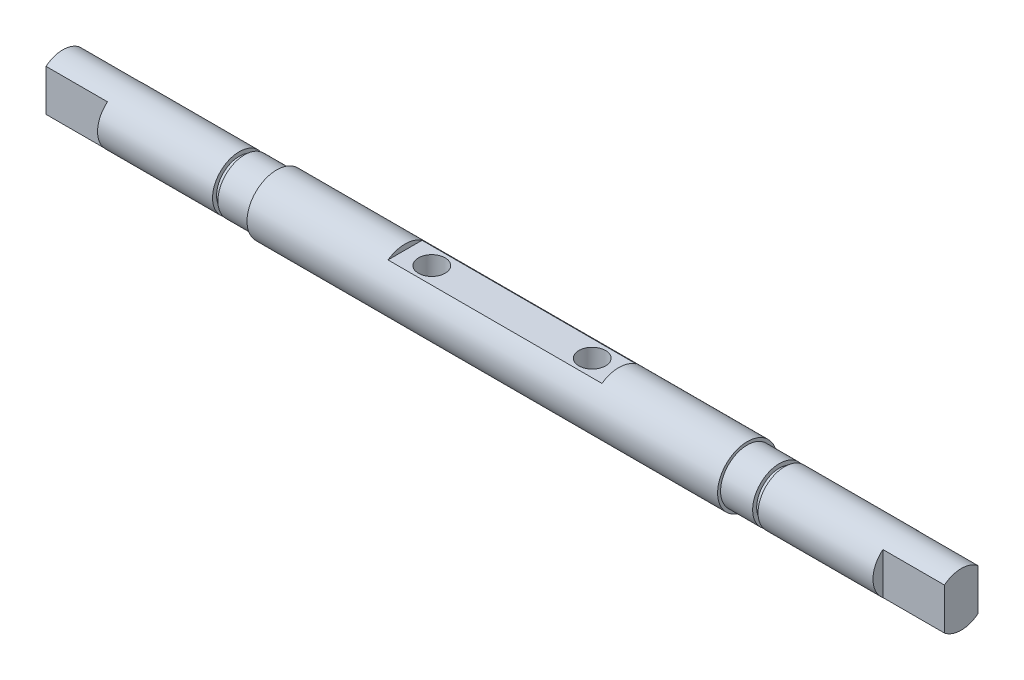
ISO-10303-21;
HEADER;
FILE_DESCRIPTION(('STEP AP214'),'2;1');
FILE_NAME('part.step','',(''),(''),'','','');
FILE_SCHEMA(('AUTOMOTIVE_DESIGN { 1 0 10303 214 1 1 1 1 }'));
ENDSEC;
DATA;
#1=APPLICATION_CONTEXT('core data for automotive mechanical design processes');
#2=APPLICATION_PROTOCOL_DEFINITION('international standard','automotive_design',2000,#1);
#3=PRODUCT_CONTEXT('',#1,'mechanical');
#4=PRODUCT('Part','Part','',(#3));
#5=PRODUCT_RELATED_PRODUCT_CATEGORY('part','',(#4));
#6=PRODUCT_DEFINITION_FORMATION('','',#4);
#7=PRODUCT_DEFINITION_CONTEXT('part definition',#1,'design');
#8=PRODUCT_DEFINITION('design','',#6,#7);
#9=PRODUCT_DEFINITION_SHAPE('','',#8);
#10=(LENGTH_UNIT() NAMED_UNIT(*) SI_UNIT(.MILLI.,.METRE.));
#11=(NAMED_UNIT(*) PLANE_ANGLE_UNIT() SI_UNIT($,.RADIAN.));
#12=(NAMED_UNIT(*) SI_UNIT($,.STERADIAN.) SOLID_ANGLE_UNIT());
#13=UNCERTAINTY_MEASURE_WITH_UNIT(LENGTH_MEASURE(1.E-05),#10,'distance_accuracy_value','');
#14=(GEOMETRIC_REPRESENTATION_CONTEXT(3) GLOBAL_UNCERTAINTY_ASSIGNED_CONTEXT((#13)) GLOBAL_UNIT_ASSIGNED_CONTEXT((#10,
#11,#12)) REPRESENTATION_CONTEXT('',''));
#15=CARTESIAN_POINT('',(0.,0.,0.));
#16=DIRECTION('',(0.,0.,1.));
#17=DIRECTION('',(1.,0.,0.));
#18=AXIS2_PLACEMENT_3D('',#15,#16,#17);
#19=CARTESIAN_POINT('',(236.505191192069,10.,0.));
#20=DIRECTION('',(1.,0.,0.));
#21=DIRECTION('',(0.,0.,1.));
#22=AXIS2_PLACEMENT_3D('',#19,#20,#21);
#23=PLANE('',#22);
#24=CARTESIAN_POINT('',(236.505191192069,0.,0.));
#25=DIRECTION('',(1.,0.,0.));
#26=DIRECTION('',(0.,0.,-1.));
#27=AXIS2_PLACEMENT_3D('',#24,#25,#26);
#28=CIRCLE('',#27,10.);
#29=CARTESIAN_POINT('',(236.505191192069,7.78345250416516,-6.27836500335925));
#30=VERTEX_POINT('',#29);
#31=CARTESIAN_POINT('',(236.505191192069,7.78345250416516,6.27836500335925));
#32=VERTEX_POINT('',#31);
#33=EDGE_CURVE('E290',#30,#32,#28,.T.);
#34=ORIENTED_EDGE('',*,*,#33,.T.);
#35=DIRECTION('',(0.,-1.,0.));
#36=VECTOR('',#35,1.);
#37=CARTESIAN_POINT('',(236.505191192069,-7.78345250416516,6.27836500335925));
#38=LINE('',#37,#36);
#39=CARTESIAN_POINT('',(236.505191192069,-7.78345250416516,6.27836500335925));
#40=VERTEX_POINT('',#39);
#41=EDGE_CURVE('E315',#32,#40,#38,.T.);
#42=ORIENTED_EDGE('',*,*,#41,.T.);
#43=CARTESIAN_POINT('',(236.505191192069,-7.78345250416516,-6.27836500335925));
#44=VERTEX_POINT('',#43);
#45=EDGE_CURVE('E292',#40,#44,#28,.T.);
#46=ORIENTED_EDGE('',*,*,#45,.T.);
#47=DIRECTION('',(0.,1.,0.));
#48=VECTOR('',#47,1.);
#49=CARTESIAN_POINT('',(236.505191192069,-7.78345250416516,-6.27836500335925));
#50=LINE('',#49,#48);
#51=EDGE_CURVE('E316',#44,#30,#50,.T.);
#52=ORIENTED_EDGE('',*,*,#51,.T.);
#53=EDGE_LOOP('',(#34,#42,#46,#52));
#54=FACE_BOUND('',#53,.T.);
#55=ADVANCED_FACE('F39',(#54),#23,.T.);
#56=CARTESIAN_POINT('',(66.5954170694878,0.,0.));
#57=DIRECTION('',(-1.,0.,0.));
#58=DIRECTION('',(0.,0.,-1.));
#59=AXIS2_PLACEMENT_3D('',#56,#57,#58);
#60=CYLINDRICAL_SURFACE('',#59,10.);
#61=CARTESIAN_POINT('',(170.505191192069,0.,0.));
#62=DIRECTION('',(1.,0.,0.));
#63=DIRECTION('',(0.,0.,-1.));
#64=AXIS2_PLACEMENT_3D('',#61,#62,#63);
#65=CIRCLE('',#64,10.);
#66=CARTESIAN_POINT('',(170.505191192069,0.,-10.));
#67=VERTEX_POINT('',#66);
#68=EDGE_CURVE('E293',#67,#67,#65,.T.);
#69=ORIENTED_EDGE('',*,*,#68,.T.);
#70=EDGE_LOOP('',(#69));
#71=FACE_BOUND('',#70,.T.);
#72=CARTESIAN_POINT('',(213.505191192069,0.,0.));
#73=DIRECTION('',(-1.,0.,0.));
#74=DIRECTION('',(0.,0.,1.));
#75=AXIS2_PLACEMENT_3D('',#72,#73,#74);
#76=CIRCLE('',#75,10.);
#77=CARTESIAN_POINT('',(213.505191192069,-7.78345250416516,6.27836500335925));
#78=VERTEX_POINT('',#77);
#79=CARTESIAN_POINT('',(213.505191192069,7.78345250416515,6.27836500335924));
#80=VERTEX_POINT('',#79);
#81=EDGE_CURVE('E330',#78,#80,#76,.T.);
#82=ORIENTED_EDGE('',*,*,#81,.T.);
#83=DIRECTION('',(1.,0.,0.));
#84=VECTOR('',#83,1.);
#85=CARTESIAN_POINT('',(213.505191192069,7.78345250416516,6.27836500335925));
#86=LINE('',#85,#84);
#87=EDGE_CURVE('E308',#80,#32,#86,.T.);
#88=ORIENTED_EDGE('',*,*,#87,.T.);
#89=ORIENTED_EDGE('',*,*,#33,.F.);
#90=DIRECTION('',(1.,0.,0.));
#91=VECTOR('',#90,1.);
#92=CARTESIAN_POINT('',(213.505191192069,7.78345250416516,-6.27836500335925));
#93=LINE('',#92,#91);
#94=CARTESIAN_POINT('',(213.505191192069,7.78345250416516,-6.27836500335925));
#95=VERTEX_POINT('',#94);
#96=EDGE_CURVE('E309',#95,#30,#93,.T.);
#97=ORIENTED_EDGE('',*,*,#96,.F.);
#98=CARTESIAN_POINT('',(213.505191192069,0.,0.));
#99=DIRECTION('',(-1.,0.,0.));
#100=DIRECTION('',(0.,0.,1.));
#101=AXIS2_PLACEMENT_3D('',#98,#99,#100);
#102=CIRCLE('',#101,10.);
#103=CARTESIAN_POINT('',(213.505191192069,-7.78345250416515,-6.27836500335924));
#104=VERTEX_POINT('',#103);
#105=EDGE_CURVE('E319',#95,#104,#102,.T.);
#106=ORIENTED_EDGE('',*,*,#105,.T.);
#107=DIRECTION('',(1.,0.,0.));
#108=VECTOR('',#107,1.);
#109=CARTESIAN_POINT('',(213.505191192069,-7.78345250416516,-6.27836500335925));
#110=LINE('',#109,#108);
#111=EDGE_CURVE('E311',#104,#44,#110,.T.);
#112=ORIENTED_EDGE('',*,*,#111,.T.);
#113=ORIENTED_EDGE('',*,*,#45,.F.);
#114=DIRECTION('',(1.,0.,0.));
#115=VECTOR('',#114,1.);
#116=CARTESIAN_POINT('',(213.505191192069,-7.78345250416516,6.27836500335925));
#117=LINE('',#116,#115);
#118=EDGE_CURVE('E323',#78,#40,#117,.T.);
#119=ORIENTED_EDGE('',*,*,#118,.F.);
#120=EDGE_LOOP('',(#82,#88,#89,#97,#106,#112,#113,#119));
#121=FACE_BOUND('',#120,.T.);
#122=ADVANCED_FACE('F178',(#71,#121),#60,.T.);
#123=CARTESIAN_POINT('',(-19.4948088079307,11.1125,0.));
#124=DIRECTION('',(-1.,0.,0.));
#125=DIRECTION('',(0.,0.,1.));
#126=AXIS2_PLACEMENT_3D('',#123,#124,#125);
#127=PLANE('',#126);
#128=CARTESIAN_POINT('',(-19.4948088079307,0.,0.));
#129=DIRECTION('',(1.,0.,0.));
#130=DIRECTION('',(0.,0.,-1.));
#131=AXIS2_PLACEMENT_3D('',#128,#129,#130);
#132=CIRCLE('',#131,10.);
#133=CARTESIAN_POINT('',(-19.4948088079307,0.,-10.));
#134=VERTEX_POINT('',#133);
#135=EDGE_CURVE('E243',#134,#134,#132,.T.);
#136=ORIENTED_EDGE('',*,*,#135,.T.);
#137=EDGE_LOOP('',(#136));
#138=FACE_BOUND('',#137,.T.);
#139=CARTESIAN_POINT('',(-19.4948088079307,0.,0.));
#140=DIRECTION('',(1.,0.,0.));
#141=DIRECTION('',(0.,0.,-1.));
#142=AXIS2_PLACEMENT_3D('',#139,#140,#141);
#143=CIRCLE('',#142,11.1125);
#144=CARTESIAN_POINT('',(-19.4948088079307,0.,-11.1125));
#145=VERTEX_POINT('',#144);
#146=EDGE_CURVE('E146',#145,#145,#143,.T.);
#147=ORIENTED_EDGE('',*,*,#146,.F.);
#148=EDGE_LOOP('',(#147));
#149=FACE_BOUND('',#148,.T.);
#150=ADVANCED_FACE('F41',(#138,#149),#127,.T.);
#151=CARTESIAN_POINT('',(70.4149653146509,0.,0.));
#152=DIRECTION('',(1.,0.,0.));
#153=DIRECTION('',(0.,0.,-1.));
#154=AXIS2_PLACEMENT_3D('',#151,#152,#153);
#155=CYLINDRICAL_SURFACE('',#154,11.1125);
#156=CARTESIAN_POINT('',(108.505191192069,0.,0.));
#157=DIRECTION('',(1.,0.,0.));
#158=DIRECTION('',(0.,0.,-1.));
#159=AXIS2_PLACEMENT_3D('',#156,#157,#158);
#160=CIRCLE('',#159,11.1125);
#161=CARTESIAN_POINT('',(108.505191192069,9.1125,6.36003144646311));
#162=VERTEX_POINT('',#161);
#163=CARTESIAN_POINT('',(108.505191192069,9.1125,-6.36003144646311));
#164=VERTEX_POINT('',#163);
#165=EDGE_CURVE('E11',#162,#164,#160,.F.);
#166=ORIENTED_EDGE('',*,*,#165,.F.);
#167=DIRECTION('',(1.,0.,0.));
#168=VECTOR('',#167,1.);
#169=CARTESIAN_POINT('',(70.4149653146509,9.1125,6.36003144646311));
#170=LINE('',#169,#168);
#171=CARTESIAN_POINT('',(28.5051911920693,9.1125,6.36003144646311));
#172=VERTEX_POINT('',#171);
#173=EDGE_CURVE('E151',#172,#162,#170,.T.);
#174=ORIENTED_EDGE('',*,*,#173,.F.);
#175=CARTESIAN_POINT('',(28.5051911920693,0.,0.));
#176=DIRECTION('',(-1.,0.,0.));
#177=DIRECTION('',(0.,0.,1.));
#178=AXIS2_PLACEMENT_3D('',#175,#176,#177);
#179=CIRCLE('',#178,11.1125);
#180=CARTESIAN_POINT('',(28.5051911920693,9.1125,-6.36003144646311));
#181=VERTEX_POINT('',#180);
#182=EDGE_CURVE('E133',#181,#172,#179,.F.);
#183=ORIENTED_EDGE('',*,*,#182,.F.);
#184=DIRECTION('',(1.,0.,0.));
#185=VECTOR('',#184,1.);
#186=CARTESIAN_POINT('',(70.4149653146509,9.1125,-6.36003144646311));
#187=LINE('',#186,#185);
#188=EDGE_CURVE('E47',#164,#181,#187,.F.);
#189=ORIENTED_EDGE('',*,*,#188,.F.);
#190=EDGE_LOOP('',(#166,#174,#183,#189));
#191=FACE_BOUND('',#190,.T.);
#192=DIRECTION('',(1.,0.,0.));
#193=VECTOR('',#192,1.);
#194=CARTESIAN_POINT('',(70.4149653146509,-9.11249999999999,6.36003144646314));
#195=LINE('',#194,#193);
#196=CARTESIAN_POINT('',(108.505191192069,-9.11249999999999,6.36003144646314));
#197=VERTEX_POINT('',#196);
#198=CARTESIAN_POINT('',(28.5051911920693,-9.11249999999999,6.36003144646314));
#199=VERTEX_POINT('',#198);
#200=EDGE_CURVE('E126',#197,#199,#195,.F.);
#201=ORIENTED_EDGE('',*,*,#200,.F.);
#202=CARTESIAN_POINT('',(108.505191192069,0.,0.));
#203=DIRECTION('',(1.,0.,0.));
#204=DIRECTION('',(0.,0.,-1.));
#205=AXIS2_PLACEMENT_3D('',#202,#203,#204);
#206=CIRCLE('',#205,11.1125);
#207=CARTESIAN_POINT('',(108.505191192069,-9.11249999999999,-6.36003144646314));
#208=VERTEX_POINT('',#207);
#209=EDGE_CURVE('E134',#208,#197,#206,.F.);
#210=ORIENTED_EDGE('',*,*,#209,.F.);
#211=DIRECTION('',(1.,0.,0.));
#212=VECTOR('',#211,1.);
#213=CARTESIAN_POINT('',(70.4149653146509,-9.11249999999999,-6.36003144646314));
#214=LINE('',#213,#212);
#215=CARTESIAN_POINT('',(28.5051911920693,-9.11249999999999,-6.36003144646314));
#216=VERTEX_POINT('',#215);
#217=EDGE_CURVE('E143',#216,#208,#214,.T.);
#218=ORIENTED_EDGE('',*,*,#217,.F.);
#219=CARTESIAN_POINT('',(28.5051911920693,0.,0.));
#220=DIRECTION('',(-1.,0.,0.));
#221=DIRECTION('',(0.,0.,1.));
#222=AXIS2_PLACEMENT_3D('',#219,#220,#221);
#223=CIRCLE('',#222,11.1125);
#224=EDGE_CURVE('E138',#199,#216,#223,.F.);
#225=ORIENTED_EDGE('',*,*,#224,.F.);
#226=EDGE_LOOP('',(#201,#210,#218,#225));
#227=FACE_BOUND('',#226,.T.);
#228=ORIENTED_EDGE('',*,*,#146,.T.);
#229=EDGE_LOOP('',(#228));
#230=FACE_BOUND('',#229,.T.);
#231=CARTESIAN_POINT('',(156.505191192069,0.,0.));
#232=DIRECTION('',(1.,0.,0.));
#233=DIRECTION('',(0.,0.,-1.));
#234=AXIS2_PLACEMENT_3D('',#231,#232,#233);
#235=CIRCLE('',#234,11.1125);
#236=CARTESIAN_POINT('',(156.505191192069,0.,-11.1125));
#237=VERTEX_POINT('',#236);
#238=EDGE_CURVE('E285',#237,#237,#235,.T.);
#239=ORIENTED_EDGE('',*,*,#238,.F.);
#240=EDGE_LOOP('',(#239));
#241=FACE_BOUND('',#240,.T.);
#242=ADVANCED_FACE('F141',(#191,#227,#230,#241),#155,.T.);
#243=CARTESIAN_POINT('',(-99.4948088079307,10.,0.));
#244=DIRECTION('',(-1.,0.,0.));
#245=DIRECTION('',(0.,0.,1.));
#246=AXIS2_PLACEMENT_3D('',#243,#244,#245);
#247=PLANE('',#246);
#248=DIRECTION('',(0.,1.,0.));
#249=VECTOR('',#248,1.);
#250=CARTESIAN_POINT('',(-99.4948088079307,-7.78345250416516,-6.27836500335925));
#251=LINE('',#250,#249);
#252=CARTESIAN_POINT('',(-99.4948088079307,-7.78345250416516,-6.27836500335925));
#253=VERTEX_POINT('',#252);
#254=CARTESIAN_POINT('',(-99.4948088079307,7.78345250416516,-6.27836500335925));
#255=VERTEX_POINT('',#254);
#256=EDGE_CURVE('E282',#253,#255,#251,.T.);
#257=ORIENTED_EDGE('',*,*,#256,.F.);
#258=CARTESIAN_POINT('',(-99.4948088079306,0.,0.));
#259=DIRECTION('',(1.,0.,0.));
#260=DIRECTION('',(0.,0.,-1.));
#261=AXIS2_PLACEMENT_3D('',#258,#259,#260);
#262=CIRCLE('',#261,10.);
#263=CARTESIAN_POINT('',(-99.4948088079307,-7.78345250416516,6.27836500335925));
#264=VERTEX_POINT('',#263);
#265=EDGE_CURVE('E246',#264,#253,#262,.T.);
#266=ORIENTED_EDGE('',*,*,#265,.F.);
#267=DIRECTION('',(0.,-1.,0.));
#268=VECTOR('',#267,1.);
#269=CARTESIAN_POINT('',(-99.4948088079307,-7.78345250416516,6.27836500335925));
#270=LINE('',#269,#268);
#271=CARTESIAN_POINT('',(-99.4948088079307,7.78345250416516,6.27836500335925));
#272=VERTEX_POINT('',#271);
#273=EDGE_CURVE('E271',#272,#264,#270,.T.);
#274=ORIENTED_EDGE('',*,*,#273,.F.);
#275=EDGE_CURVE('E248',#255,#272,#262,.T.);
#276=ORIENTED_EDGE('',*,*,#275,.F.);
#277=EDGE_LOOP('',(#257,#266,#274,#276));
#278=FACE_BOUND('',#277,.T.);
#279=ADVANCED_FACE('F229',(#278),#247,.T.);
#280=CARTESIAN_POINT('',(70.4149653146509,0.,0.));
#281=DIRECTION('',(1.,0.,0.));
#282=DIRECTION('',(0.,0.,-1.));
#283=AXIS2_PLACEMENT_3D('',#280,#281,#282);
#284=CYLINDRICAL_SURFACE('',#283,10.);
#285=DIRECTION('',(-1.,0.,0.));
#286=VECTOR('',#285,1.);
#287=CARTESIAN_POINT('',(-76.4948088079307,-7.78345250416516,-6.27836500335925));
#288=LINE('',#287,#286);
#289=CARTESIAN_POINT('',(-76.4948088079307,-7.78345250416516,-6.27836500335925));
#290=VERTEX_POINT('',#289);
#291=EDGE_CURVE('E277',#290,#253,#288,.T.);
#292=ORIENTED_EDGE('',*,*,#291,.F.);
#293=CARTESIAN_POINT('',(-76.4948088079307,0.,0.));
#294=DIRECTION('',(-1.,0.,0.));
#295=DIRECTION('',(0.,0.,1.));
#296=AXIS2_PLACEMENT_3D('',#293,#294,#295);
#297=CIRCLE('',#296,10.);
#298=CARTESIAN_POINT('',(-76.4948088079307,7.78345250416515,-6.27836500335924));
#299=VERTEX_POINT('',#298);
#300=EDGE_CURVE('E284',#299,#290,#297,.T.);
#301=ORIENTED_EDGE('',*,*,#300,.F.);
#302=DIRECTION('',(-1.,0.,0.));
#303=VECTOR('',#302,1.);
#304=CARTESIAN_POINT('',(-76.4948088079307,7.78345250416516,-6.27836500335925));
#305=LINE('',#304,#303);
#306=EDGE_CURVE('E274',#299,#255,#305,.T.);
#307=ORIENTED_EDGE('',*,*,#306,.T.);
#308=ORIENTED_EDGE('',*,*,#275,.T.);
#309=DIRECTION('',(-1.,0.,0.));
#310=VECTOR('',#309,1.);
#311=CARTESIAN_POINT('',(-76.4948088079307,7.78345250416516,6.27836500335925));
#312=LINE('',#311,#310);
#313=CARTESIAN_POINT('',(-76.4948088079307,7.78345250416516,6.27836500335925));
#314=VERTEX_POINT('',#313);
#315=EDGE_CURVE('E265',#314,#272,#312,.T.);
#316=ORIENTED_EDGE('',*,*,#315,.F.);
#317=CARTESIAN_POINT('',(-76.4948088079307,0.,0.));
#318=DIRECTION('',(-1.,0.,0.));
#319=DIRECTION('',(0.,0.,1.));
#320=AXIS2_PLACEMENT_3D('',#317,#318,#319);
#321=CIRCLE('',#320,10.);
#322=CARTESIAN_POINT('',(-76.4948088079307,-7.78345250416515,6.27836500335924));
#323=VERTEX_POINT('',#322);
#324=EDGE_CURVE('E273',#323,#314,#321,.T.);
#325=ORIENTED_EDGE('',*,*,#324,.F.);
#326=DIRECTION('',(-1.,0.,0.));
#327=VECTOR('',#326,1.);
#328=CARTESIAN_POINT('',(-76.4948088079307,-7.78345250416516,6.27836500335925));
#329=LINE('',#328,#327);
#330=EDGE_CURVE('E264',#323,#264,#329,.T.);
#331=ORIENTED_EDGE('',*,*,#330,.T.);
#332=ORIENTED_EDGE('',*,*,#265,.T.);
#333=EDGE_LOOP('',(#292,#301,#307,#308,#316,#325,#331,#332));
#334=FACE_BOUND('',#333,.T.);
#335=CARTESIAN_POINT('',(-33.4948088079307,0.,0.));
#336=DIRECTION('',(1.,0.,0.));
#337=DIRECTION('',(0.,0.,-1.));
#338=AXIS2_PLACEMENT_3D('',#335,#336,#337);
#339=CIRCLE('',#338,10.);
#340=CARTESIAN_POINT('',(-33.4948088079307,0.,-10.));
#341=VERTEX_POINT('',#340);
#342=EDGE_CURVE('E251',#341,#341,#339,.T.);
#343=ORIENTED_EDGE('',*,*,#342,.F.);
#344=EDGE_LOOP('',(#343));
#345=FACE_BOUND('',#344,.T.);
#346=ADVANCED_FACE('F225',(#334,#345),#284,.T.);
#347=CARTESIAN_POINT('',(-33.4948088079307,10.,0.));
#348=DIRECTION('',(1.,0.,0.));
#349=DIRECTION('',(0.,0.,-1.));
#350=AXIS2_PLACEMENT_3D('',#347,#348,#349);
#351=PLANE('',#350);
#352=ORIENTED_EDGE('',*,*,#342,.T.);
#353=EDGE_LOOP('',(#352));
#354=FACE_BOUND('',#353,.T.);
#355=CARTESIAN_POINT('',(-33.4948088079307,0.,0.));
#356=DIRECTION('',(1.,0.,0.));
#357=DIRECTION('',(0.,0.,-1.));
#358=AXIS2_PLACEMENT_3D('',#355,#356,#357);
#359=CIRCLE('',#358,8.49999999999999);
#360=CARTESIAN_POINT('',(-33.4948088079307,0.,-8.49999999999999));
#361=VERTEX_POINT('',#360);
#362=EDGE_CURVE('E254',#361,#361,#359,.T.);
#363=ORIENTED_EDGE('',*,*,#362,.F.);
#364=EDGE_LOOP('',(#363));
#365=FACE_BOUND('',#364,.T.);
#366=ADVANCED_FACE('F221',(#354,#365),#351,.T.);
#367=CARTESIAN_POINT('',(70.4149653146509,0.,0.));
#368=DIRECTION('',(1.,0.,0.));
#369=DIRECTION('',(0.,0.,-1.));
#370=AXIS2_PLACEMENT_3D('',#367,#368,#369);
#371=CYLINDRICAL_SURFACE('',#370,8.49999999999999);
#372=ORIENTED_EDGE('',*,*,#362,.T.);
#373=EDGE_LOOP('',(#372));
#374=FACE_BOUND('',#373,.T.);
#375=CARTESIAN_POINT('',(-31.4948088079307,0.,0.));
#376=DIRECTION('',(1.,0.,0.));
#377=DIRECTION('',(0.,0.,-1.));
#378=AXIS2_PLACEMENT_3D('',#375,#376,#377);
#379=CIRCLE('',#378,8.49999999999999);
#380=CARTESIAN_POINT('',(-31.4948088079307,0.,-8.49999999999999));
#381=VERTEX_POINT('',#380);
#382=EDGE_CURVE('E257',#381,#381,#379,.T.);
#383=ORIENTED_EDGE('',*,*,#382,.F.);
#384=EDGE_LOOP('',(#383));
#385=FACE_BOUND('',#384,.T.);
#386=ADVANCED_FACE('F217',(#374,#385),#371,.T.);
#387=CARTESIAN_POINT('',(-31.4948088079307,10.,0.));
#388=DIRECTION('',(-1.,0.,0.));
#389=DIRECTION('',(0.,0.,1.));
#390=AXIS2_PLACEMENT_3D('',#387,#388,#389);
#391=PLANE('',#390);
#392=ORIENTED_EDGE('',*,*,#382,.T.);
#393=EDGE_LOOP('',(#392));
#394=FACE_BOUND('',#393,.T.);
#395=CARTESIAN_POINT('',(-31.4948088079307,0.,0.));
#396=DIRECTION('',(1.,0.,0.));
#397=DIRECTION('',(0.,0.,-1.));
#398=AXIS2_PLACEMENT_3D('',#395,#396,#397);
#399=CIRCLE('',#398,10.);
#400=CARTESIAN_POINT('',(-31.4948088079307,0.,-10.));
#401=VERTEX_POINT('',#400);
#402=EDGE_CURVE('E260',#401,#401,#399,.T.);
#403=ORIENTED_EDGE('',*,*,#402,.F.);
#404=EDGE_LOOP('',(#403));
#405=FACE_BOUND('',#404,.T.);
#406=ADVANCED_FACE('F213',(#394,#405),#391,.T.);
#407=CARTESIAN_POINT('',(70.4149653146509,0.,0.));
#408=DIRECTION('',(1.,0.,0.));
#409=DIRECTION('',(0.,0.,-1.));
#410=AXIS2_PLACEMENT_3D('',#407,#408,#409);
#411=CYLINDRICAL_SURFACE('',#410,10.);
#412=ORIENTED_EDGE('',*,*,#402,.T.);
#413=EDGE_LOOP('',(#412));
#414=FACE_BOUND('',#413,.T.);
#415=ORIENTED_EDGE('',*,*,#135,.F.);
#416=EDGE_LOOP('',(#415));
#417=FACE_BOUND('',#416,.T.);
#418=ADVANCED_FACE('F209',(#414,#417),#411,.T.);
#419=CARTESIAN_POINT('',(-76.4948088079307,-7.78345250416516,6.27836500335925));
#420=DIRECTION('',(0.,0.,-1.));
#421=DIRECTION('',(-1.,0.,0.));
#422=AXIS2_PLACEMENT_3D('',#419,#420,#421);
#423=PLANE('',#422);
#424=ORIENTED_EDGE('',*,*,#273,.T.);
#425=ORIENTED_EDGE('',*,*,#330,.F.);
#426=DIRECTION('',(0.,-1.,0.));
#427=VECTOR('',#426,1.);
#428=CARTESIAN_POINT('',(-76.4948088079307,-7.78345250416516,6.27836500335925));
#429=LINE('',#428,#427);
#430=EDGE_CURVE('E268',#314,#323,#429,.T.);
#431=ORIENTED_EDGE('',*,*,#430,.F.);
#432=ORIENTED_EDGE('',*,*,#315,.T.);
#433=EDGE_LOOP('',(#424,#425,#431,#432));
#434=FACE_BOUND('',#433,.T.);
#435=ADVANCED_FACE('F205',(#434),#423,.F.);
#436=CARTESIAN_POINT('',(-76.4948088079307,0.,0.));
#437=DIRECTION('',(-1.,0.,0.));
#438=DIRECTION('',(0.,0.,1.));
#439=AXIS2_PLACEMENT_3D('',#436,#437,#438);
#440=PLANE('',#439);
#441=ORIENTED_EDGE('',*,*,#324,.T.);
#442=ORIENTED_EDGE('',*,*,#430,.T.);
#443=EDGE_LOOP('',(#441,#442));
#444=FACE_BOUND('',#443,.T.);
#445=ADVANCED_FACE('F201',(#444),#440,.T.);
#446=CARTESIAN_POINT('',(-76.4948088079307,-7.78345250416516,-6.27836500335925));
#447=DIRECTION('',(0.,0.,1.));
#448=DIRECTION('',(1.,0.,0.));
#449=AXIS2_PLACEMENT_3D('',#446,#447,#448);
#450=PLANE('',#449);
#451=ORIENTED_EDGE('',*,*,#256,.T.);
#452=ORIENTED_EDGE('',*,*,#306,.F.);
#453=DIRECTION('',(0.,1.,0.));
#454=VECTOR('',#453,1.);
#455=CARTESIAN_POINT('',(-76.4948088079307,-7.78345250416516,-6.27836500335925));
#456=LINE('',#455,#454);
#457=EDGE_CURVE('E279',#290,#299,#456,.T.);
#458=ORIENTED_EDGE('',*,*,#457,.F.);
#459=ORIENTED_EDGE('',*,*,#291,.T.);
#460=EDGE_LOOP('',(#451,#452,#458,#459));
#461=FACE_BOUND('',#460,.T.);
#462=ADVANCED_FACE('F197',(#461),#450,.F.);
#463=CARTESIAN_POINT('',(-76.4948088079307,0.,0.));
#464=DIRECTION('',(-1.,0.,0.));
#465=DIRECTION('',(0.,0.,1.));
#466=AXIS2_PLACEMENT_3D('',#463,#464,#465);
#467=PLANE('',#466);
#468=ORIENTED_EDGE('',*,*,#300,.T.);
#469=ORIENTED_EDGE('',*,*,#457,.T.);
#470=EDGE_LOOP('',(#468,#469));
#471=FACE_BOUND('',#470,.T.);
#472=ADVANCED_FACE('F193',(#471),#467,.T.);
#473=CARTESIAN_POINT('',(156.505191192069,11.1125,0.));
#474=DIRECTION('',(1.,0.,0.));
#475=DIRECTION('',(0.,0.,1.));
#476=AXIS2_PLACEMENT_3D('',#473,#474,#475);
#477=PLANE('',#476);
#478=CARTESIAN_POINT('',(156.505191192069,0.,0.));
#479=DIRECTION('',(1.,0.,0.));
#480=DIRECTION('',(0.,0.,-1.));
#481=AXIS2_PLACEMENT_3D('',#478,#479,#480);
#482=CIRCLE('',#481,10.);
#483=CARTESIAN_POINT('',(156.505191192069,0.,-10.));
#484=VERTEX_POINT('',#483);
#485=EDGE_CURVE('E305',#484,#484,#482,.T.);
#486=ORIENTED_EDGE('',*,*,#485,.F.);
#487=EDGE_LOOP('',(#486));
#488=FACE_BOUND('',#487,.T.);
#489=ORIENTED_EDGE('',*,*,#238,.T.);
#490=EDGE_LOOP('',(#489));
#491=FACE_BOUND('',#490,.T.);
#492=ADVANCED_FACE('F189',(#488,#491),#477,.T.);
#493=CARTESIAN_POINT('',(170.505191192069,10.,0.));
#494=DIRECTION('',(-1.,0.,0.));
#495=DIRECTION('',(0.,0.,-1.));
#496=AXIS2_PLACEMENT_3D('',#493,#494,#495);
#497=PLANE('',#496);
#498=ORIENTED_EDGE('',*,*,#68,.F.);
#499=EDGE_LOOP('',(#498));
#500=FACE_BOUND('',#499,.T.);
#501=CARTESIAN_POINT('',(170.505191192069,0.,0.));
#502=DIRECTION('',(1.,0.,0.));
#503=DIRECTION('',(0.,0.,-1.));
#504=AXIS2_PLACEMENT_3D('',#501,#502,#503);
#505=CIRCLE('',#504,8.49999999999999);
#506=CARTESIAN_POINT('',(170.505191192069,0.,-8.49999999999999));
#507=VERTEX_POINT('',#506);
#508=EDGE_CURVE('E296',#507,#507,#505,.T.);
#509=ORIENTED_EDGE('',*,*,#508,.T.);
#510=EDGE_LOOP('',(#509));
#511=FACE_BOUND('',#510,.T.);
#512=ADVANCED_FACE('F192',(#500,#511),#497,.T.);
#513=CARTESIAN_POINT('',(66.5954170694878,0.,0.));
#514=DIRECTION('',(-1.,0.,0.));
#515=DIRECTION('',(0.,0.,-1.));
#516=AXIS2_PLACEMENT_3D('',#513,#514,#515);
#517=CYLINDRICAL_SURFACE('',#516,8.49999999999999);
#518=ORIENTED_EDGE('',*,*,#508,.F.);
#519=EDGE_LOOP('',(#518));
#520=FACE_BOUND('',#519,.T.);
#521=CARTESIAN_POINT('',(168.505191192069,0.,0.));
#522=DIRECTION('',(1.,0.,0.));
#523=DIRECTION('',(0.,0.,-1.));
#524=AXIS2_PLACEMENT_3D('',#521,#522,#523);
#525=CIRCLE('',#524,8.49999999999999);
#526=CARTESIAN_POINT('',(168.505191192069,0.,-8.49999999999999));
#527=VERTEX_POINT('',#526);
#528=EDGE_CURVE('E299',#527,#527,#525,.T.);
#529=ORIENTED_EDGE('',*,*,#528,.T.);
#530=EDGE_LOOP('',(#529));
#531=FACE_BOUND('',#530,.T.);
#532=ADVANCED_FACE('F393',(#520,#531),#517,.T.);
#533=CARTESIAN_POINT('',(168.505191192069,10.,0.));
#534=DIRECTION('',(1.,0.,0.));
#535=DIRECTION('',(0.,0.,1.));
#536=AXIS2_PLACEMENT_3D('',#533,#534,#535);
#537=PLANE('',#536);
#538=ORIENTED_EDGE('',*,*,#528,.F.);
#539=EDGE_LOOP('',(#538));
#540=FACE_BOUND('',#539,.T.);
#541=CARTESIAN_POINT('',(168.505191192069,0.,0.));
#542=DIRECTION('',(1.,0.,0.));
#543=DIRECTION('',(0.,0.,-1.));
#544=AXIS2_PLACEMENT_3D('',#541,#542,#543);
#545=CIRCLE('',#544,10.);
#546=CARTESIAN_POINT('',(168.505191192069,0.,-10.));
#547=VERTEX_POINT('',#546);
#548=EDGE_CURVE('E302',#547,#547,#545,.T.);
#549=ORIENTED_EDGE('',*,*,#548,.T.);
#550=EDGE_LOOP('',(#549));
#551=FACE_BOUND('',#550,.T.);
#552=ADVANCED_FACE('F389',(#540,#551),#537,.T.);
#553=CARTESIAN_POINT('',(66.5954170694878,0.,0.));
#554=DIRECTION('',(-1.,0.,0.));
#555=DIRECTION('',(0.,0.,-1.));
#556=AXIS2_PLACEMENT_3D('',#553,#554,#555);
#557=CYLINDRICAL_SURFACE('',#556,10.);
#558=ORIENTED_EDGE('',*,*,#548,.F.);
#559=EDGE_LOOP('',(#558));
#560=FACE_BOUND('',#559,.T.);
#561=ORIENTED_EDGE('',*,*,#485,.T.);
#562=EDGE_LOOP('',(#561));
#563=FACE_BOUND('',#562,.T.);
#564=ADVANCED_FACE('F385',(#560,#563),#557,.T.);
#565=CARTESIAN_POINT('',(213.505191192069,-7.78345250416516,-6.27836500335925));
#566=DIRECTION('',(0.,0.,-1.));
#567=DIRECTION('',(-1.,0.,0.));
#568=AXIS2_PLACEMENT_3D('',#565,#566,#567);
#569=PLANE('',#568);
#570=ORIENTED_EDGE('',*,*,#51,.F.);
#571=ORIENTED_EDGE('',*,*,#111,.F.);
#572=DIRECTION('',(0.,1.,0.));
#573=VECTOR('',#572,1.);
#574=CARTESIAN_POINT('',(213.505191192069,-7.78345250416516,-6.27836500335925));
#575=LINE('',#574,#573);
#576=EDGE_CURVE('E312',#104,#95,#575,.T.);
#577=ORIENTED_EDGE('',*,*,#576,.T.);
#578=ORIENTED_EDGE('',*,*,#96,.T.);
#579=EDGE_LOOP('',(#570,#571,#577,#578));
#580=FACE_BOUND('',#579,.T.);
#581=ADVANCED_FACE('F381',(#580),#569,.T.);
#582=CARTESIAN_POINT('',(213.505191192069,0.,0.));
#583=DIRECTION('',(1.,0.,0.));
#584=DIRECTION('',(0.,0.,1.));
#585=AXIS2_PLACEMENT_3D('',#582,#583,#584);
#586=PLANE('',#585);
#587=ORIENTED_EDGE('',*,*,#105,.F.);
#588=ORIENTED_EDGE('',*,*,#576,.F.);
#589=EDGE_LOOP('',(#587,#588));
#590=FACE_BOUND('',#589,.T.);
#591=ADVANCED_FACE('F377',(#590),#586,.T.);
#592=CARTESIAN_POINT('',(213.505191192069,-7.78345250416516,6.27836500335925));
#593=DIRECTION('',(0.,0.,1.));
#594=DIRECTION('',(1.,0.,0.));
#595=AXIS2_PLACEMENT_3D('',#592,#593,#594);
#596=PLANE('',#595);
#597=ORIENTED_EDGE('',*,*,#41,.F.);
#598=ORIENTED_EDGE('',*,*,#87,.F.);
#599=DIRECTION('',(0.,-1.,0.));
#600=VECTOR('',#599,1.);
#601=CARTESIAN_POINT('',(213.505191192069,-7.78345250416516,6.27836500335925));
#602=LINE('',#601,#600);
#603=EDGE_CURVE('E325',#80,#78,#602,.T.);
#604=ORIENTED_EDGE('',*,*,#603,.T.);
#605=ORIENTED_EDGE('',*,*,#118,.T.);
#606=EDGE_LOOP('',(#597,#598,#604,#605));
#607=FACE_BOUND('',#606,.T.);
#608=ADVANCED_FACE('F373',(#607),#596,.T.);
#609=CARTESIAN_POINT('',(213.505191192069,0.,0.));
#610=DIRECTION('',(1.,0.,0.));
#611=DIRECTION('',(0.,0.,1.));
#612=AXIS2_PLACEMENT_3D('',#609,#610,#611);
#613=PLANE('',#612);
#614=ORIENTED_EDGE('',*,*,#81,.F.);
#615=ORIENTED_EDGE('',*,*,#603,.F.);
#616=EDGE_LOOP('',(#614,#615));
#617=FACE_BOUND('',#616,.T.);
#618=ADVANCED_FACE('F369',(#617),#613,.T.);
#619=CARTESIAN_POINT('',(108.505191192069,-13.1125,-11.1125));
#620=DIRECTION('',(1.,0.,0.));
#621=DIRECTION('',(0.,0.,-1.));
#622=AXIS2_PLACEMENT_3D('',#619,#620,#621);
#623=PLANE('',#622);
#624=ORIENTED_EDGE('',*,*,#209,.T.);
#625=DIRECTION('',(0.,0.,1.));
#626=VECTOR('',#625,1.);
#627=CARTESIAN_POINT('',(108.505191192069,-9.11249999999999,-11.1125));
#628=LINE('',#627,#626);
#629=EDGE_CURVE('E129',#208,#197,#628,.T.);
#630=ORIENTED_EDGE('',*,*,#629,.F.);
#631=EDGE_LOOP('',(#624,#630));
#632=FACE_BOUND('',#631,.T.);
#633=ADVANCED_FACE('F364',(#632),#623,.F.);
#634=CARTESIAN_POINT('',(28.5051911920693,-13.1125,-11.1125));
#635=DIRECTION('',(-1.,0.,0.));
#636=DIRECTION('',(0.,0.,1.));
#637=AXIS2_PLACEMENT_3D('',#634,#635,#636);
#638=PLANE('',#637);
#639=ORIENTED_EDGE('',*,*,#224,.T.);
#640=DIRECTION('',(0.,0.,1.));
#641=VECTOR('',#640,1.);
#642=CARTESIAN_POINT('',(28.5051911920693,-9.11249999999999,-11.1125));
#643=LINE('',#642,#641);
#644=EDGE_CURVE('E61',#216,#199,#643,.T.);
#645=ORIENTED_EDGE('',*,*,#644,.T.);
#646=EDGE_LOOP('',(#639,#645));
#647=FACE_BOUND('',#646,.T.);
#648=ADVANCED_FACE('F137',(#647),#638,.F.);
#649=CARTESIAN_POINT('',(28.5051911920693,-9.11249999999999,-11.1125));
#650=DIRECTION('',(0.,1.,0.));
#651=DIRECTION('',(0.,0.,1.));
#652=AXIS2_PLACEMENT_3D('',#649,#650,#651);
#653=PLANE('',#652);
#654=CARTESIAN_POINT('',(38.5051911920693,-9.11249999999999,0.));
#655=DIRECTION('',(0.,1.,0.));
#656=DIRECTION('',(0.,0.,1.));
#657=AXIS2_PLACEMENT_3D('',#654,#655,#656);
#658=CIRCLE('',#657,5.);
#659=CARTESIAN_POINT('',(38.5051911920693,-9.11249999999999,5.));
#660=VERTEX_POINT('',#659);
#661=EDGE_CURVE('E334',#660,#660,#658,.T.);
#662=ORIENTED_EDGE('',*,*,#661,.T.);
#663=EDGE_LOOP('',(#662));
#664=FACE_BOUND('',#663,.T.);
#665=CARTESIAN_POINT('',(98.5051911920693,-9.11249999999999,0.));
#666=DIRECTION('',(0.,1.,0.));
#667=DIRECTION('',(0.,0.,1.));
#668=AXIS2_PLACEMENT_3D('',#665,#666,#667);
#669=CIRCLE('',#668,5.);
#670=CARTESIAN_POINT('',(98.5051911920693,-9.11249999999999,5.));
#671=VERTEX_POINT('',#670);
#672=EDGE_CURVE('E340',#671,#671,#669,.T.);
#673=ORIENTED_EDGE('',*,*,#672,.T.);
#674=EDGE_LOOP('',(#673));
#675=FACE_BOUND('',#674,.T.);
#676=ORIENTED_EDGE('',*,*,#200,.T.);
#677=ORIENTED_EDGE('',*,*,#644,.F.);
#678=ORIENTED_EDGE('',*,*,#217,.T.);
#679=ORIENTED_EDGE('',*,*,#629,.T.);
#680=EDGE_LOOP('',(#676,#677,#678,#679));
#681=FACE_BOUND('',#680,.T.);
#682=ADVANCED_FACE('F127',(#664,#675,#681),#653,.F.);
#683=CARTESIAN_POINT('',(108.505191192069,9.1125,-11.1125));
#684=DIRECTION('',(1.,0.,0.));
#685=DIRECTION('',(0.,0.,-1.));
#686=AXIS2_PLACEMENT_3D('',#683,#684,#685);
#687=PLANE('',#686);
#688=ORIENTED_EDGE('',*,*,#165,.T.);
#689=DIRECTION('',(0.,0.,1.));
#690=VECTOR('',#689,1.);
#691=CARTESIAN_POINT('',(108.505191192069,9.1125,-11.1125));
#692=LINE('',#691,#690);
#693=EDGE_CURVE('E159',#164,#162,#692,.T.);
#694=ORIENTED_EDGE('',*,*,#693,.T.);
#695=EDGE_LOOP('',(#688,#694));
#696=FACE_BOUND('',#695,.T.);
#697=ADVANCED_FACE('F173',(#696),#687,.F.);
#698=CARTESIAN_POINT('',(28.5051911920693,9.1125,-11.1125));
#699=DIRECTION('',(0.,-1.,0.));
#700=DIRECTION('',(0.,0.,-1.));
#701=AXIS2_PLACEMENT_3D('',#698,#699,#700);
#702=PLANE('',#701);
#703=CARTESIAN_POINT('',(38.5051911920693,9.1125,0.));
#704=DIRECTION('',(0.,1.,0.));
#705=DIRECTION('',(0.,0.,1.));
#706=AXIS2_PLACEMENT_3D('',#703,#704,#705);
#707=CIRCLE('',#706,5.);
#708=CARTESIAN_POINT('',(38.5051911920693,9.1125,5.));
#709=VERTEX_POINT('',#708);
#710=EDGE_CURVE('E343',#709,#709,#707,.T.);
#711=ORIENTED_EDGE('',*,*,#710,.F.);
#712=EDGE_LOOP('',(#711));
#713=FACE_BOUND('',#712,.T.);
#714=CARTESIAN_POINT('',(98.5051911920693,9.1125,0.));
#715=DIRECTION('',(0.,1.,0.));
#716=DIRECTION('',(0.,0.,1.));
#717=AXIS2_PLACEMENT_3D('',#714,#715,#716);
#718=CIRCLE('',#717,5.);
#719=CARTESIAN_POINT('',(98.5051911920693,9.1125,5.));
#720=VERTEX_POINT('',#719);
#721=EDGE_CURVE('E344',#720,#720,#718,.T.);
#722=ORIENTED_EDGE('',*,*,#721,.F.);
#723=EDGE_LOOP('',(#722));
#724=FACE_BOUND('',#723,.T.);
#725=ORIENTED_EDGE('',*,*,#188,.T.);
#726=DIRECTION('',(0.,0.,1.));
#727=VECTOR('',#726,1.);
#728=CARTESIAN_POINT('',(28.5051911920693,9.1125,-11.1125));
#729=LINE('',#728,#727);
#730=EDGE_CURVE('E53',#181,#172,#729,.T.);
#731=ORIENTED_EDGE('',*,*,#730,.T.);
#732=ORIENTED_EDGE('',*,*,#173,.T.);
#733=ORIENTED_EDGE('',*,*,#693,.F.);
#734=EDGE_LOOP('',(#725,#731,#732,#733));
#735=FACE_BOUND('',#734,.T.);
#736=ADVANCED_FACE('F156',(#713,#724,#735),#702,.F.);
#737=CARTESIAN_POINT('',(28.5051911920693,9.1125,-11.1125));
#738=DIRECTION('',(-1.,0.,0.));
#739=DIRECTION('',(0.,0.,1.));
#740=AXIS2_PLACEMENT_3D('',#737,#738,#739);
#741=PLANE('',#740);
#742=ORIENTED_EDGE('',*,*,#182,.T.);
#743=ORIENTED_EDGE('',*,*,#730,.F.);
#744=EDGE_LOOP('',(#742,#743));
#745=FACE_BOUND('',#744,.T.);
#746=ADVANCED_FACE('F162',(#745),#741,.F.);
#747=CARTESIAN_POINT('',(98.5051911920693,-11.1125,0.));
#748=DIRECTION('',(0.,1.,0.));
#749=DIRECTION('',(0.,0.,1.));
#750=AXIS2_PLACEMENT_3D('',#747,#748,#749);
#751=CYLINDRICAL_SURFACE('',#750,5.);
#752=ORIENTED_EDGE('',*,*,#721,.T.);
#753=EDGE_LOOP('',(#752));
#754=FACE_BOUND('',#753,.T.);
#755=ORIENTED_EDGE('',*,*,#672,.F.);
#756=EDGE_LOOP('',(#755));
#757=FACE_BOUND('',#756,.T.);
#758=ADVANCED_FACE('F164',(#754,#757),#751,.F.);
#759=CARTESIAN_POINT('',(38.5051911920693,-11.1125,0.));
#760=DIRECTION('',(0.,1.,0.));
#761=DIRECTION('',(0.,0.,1.));
#762=AXIS2_PLACEMENT_3D('',#759,#760,#761);
#763=CYLINDRICAL_SURFACE('',#762,5.);
#764=ORIENTED_EDGE('',*,*,#710,.T.);
#765=EDGE_LOOP('',(#764));
#766=FACE_BOUND('',#765,.T.);
#767=ORIENTED_EDGE('',*,*,#661,.F.);
#768=EDGE_LOOP('',(#767));
#769=FACE_BOUND('',#768,.T.);
#770=ADVANCED_FACE('F170',(#766,#769),#763,.F.);
#771=CLOSED_SHELL('',(#55,#122,#150,#242,#279,#346,#366,#386,#406,#418,#435,#445,#462,#472,#492,
#512,#532,#552,#564,#581,#591,#608,#618,#633,#648,#682,#697,#736,#746,#758,#770));
#772=MANIFOLD_SOLID_BREP('B2',#771);
#773=ADVANCED_BREP_SHAPE_REPRESENTATION('',(#18,#772),#14);
#774=SHAPE_DEFINITION_REPRESENTATION(#9,#773);
ENDSEC;
END-ISO-10303-21;
